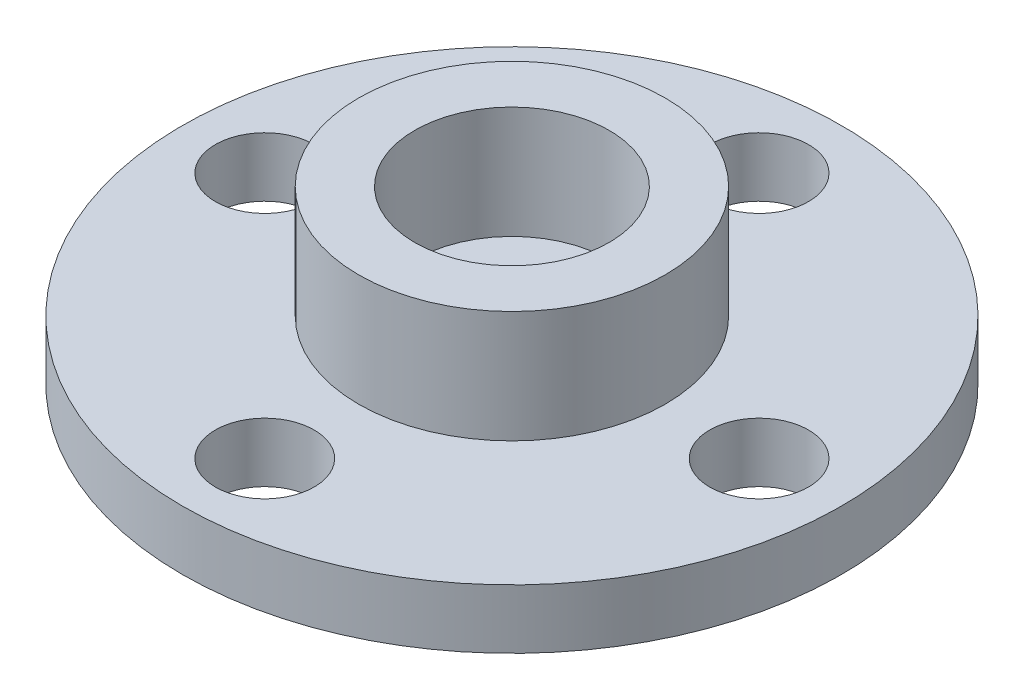
ISO-10303-21;
HEADER;
FILE_DESCRIPTION(('STEP AP214'),'2;1');
FILE_NAME('part.step','',(''),(''),'','','');
FILE_SCHEMA(('AUTOMOTIVE_DESIGN { 1 0 10303 214 1 1 1 1 }'));
ENDSEC;
DATA;
#1=APPLICATION_CONTEXT('core data for automotive mechanical design processes');
#2=APPLICATION_PROTOCOL_DEFINITION('international standard','automotive_design',2000,#1);
#3=PRODUCT_CONTEXT('',#1,'mechanical');
#4=PRODUCT('Part','Part','',(#3));
#5=PRODUCT_RELATED_PRODUCT_CATEGORY('part','',(#4));
#6=PRODUCT_DEFINITION_FORMATION('','',#4);
#7=PRODUCT_DEFINITION_CONTEXT('part definition',#1,'design');
#8=PRODUCT_DEFINITION('design','',#6,#7);
#9=PRODUCT_DEFINITION_SHAPE('','',#8);
#10=(LENGTH_UNIT() NAMED_UNIT(*) SI_UNIT(.MILLI.,.METRE.));
#11=(NAMED_UNIT(*) PLANE_ANGLE_UNIT() SI_UNIT($,.RADIAN.));
#12=(NAMED_UNIT(*) SI_UNIT($,.STERADIAN.) SOLID_ANGLE_UNIT());
#13=UNCERTAINTY_MEASURE_WITH_UNIT(LENGTH_MEASURE(1.E-05),#10,'distance_accuracy_value','');
#14=(GEOMETRIC_REPRESENTATION_CONTEXT(3) GLOBAL_UNCERTAINTY_ASSIGNED_CONTEXT((#13)) GLOBAL_UNIT_ASSIGNED_CONTEXT((#10,
#11,#12)) REPRESENTATION_CONTEXT('',''));
#15=CARTESIAN_POINT('',(0.,0.,0.));
#16=DIRECTION('',(0.,0.,1.));
#17=DIRECTION('',(1.,0.,0.));
#18=AXIS2_PLACEMENT_3D('',#15,#16,#17);
#19=CARTESIAN_POINT('',(0.,5.2,0.));
#20=DIRECTION('',(0.,-1.,0.));
#21=DIRECTION('',(0.,0.,-1.));
#22=AXIS2_PLACEMENT_3D('',#19,#20,#21);
#23=CYLINDRICAL_SURFACE('',#22,10.);
#24=CARTESIAN_POINT('',(0.,0.,0.));
#25=DIRECTION('',(0.,1.,0.));
#26=DIRECTION('',(0.,0.,1.));
#27=AXIS2_PLACEMENT_3D('',#24,#25,#26);
#28=CIRCLE('',#27,10.);
#29=CARTESIAN_POINT('',(0.,0.,10.));
#30=VERTEX_POINT('',#29);
#31=EDGE_CURVE('E10',#30,#30,#28,.T.);
#32=ORIENTED_EDGE('',*,*,#31,.T.);
#33=EDGE_LOOP('',(#32));
#34=FACE_BOUND('',#33,.T.);
#35=CARTESIAN_POINT('',(0.,1.8,0.));
#36=DIRECTION('',(0.,1.,0.));
#37=DIRECTION('',(0.,0.,1.));
#38=AXIS2_PLACEMENT_3D('',#35,#36,#37);
#39=CIRCLE('',#38,10.);
#40=CARTESIAN_POINT('',(0.,1.8,10.));
#41=VERTEX_POINT('',#40);
#42=EDGE_CURVE('E36',#41,#41,#39,.T.);
#43=ORIENTED_EDGE('',*,*,#42,.F.);
#44=EDGE_LOOP('',(#43));
#45=FACE_BOUND('',#44,.T.);
#46=ADVANCED_FACE('F30',(#34,#45),#23,.T.);
#47=CARTESIAN_POINT('',(0.,0.,0.));
#48=DIRECTION('',(0.,1.,0.));
#49=DIRECTION('',(0.,0.,1.));
#50=AXIS2_PLACEMENT_3D('',#47,#48,#49);
#51=PLANE('',#50);
#52=CARTESIAN_POINT('',(0.,0.,7.5));
#53=DIRECTION('',(0.,1.,0.));
#54=DIRECTION('',(0.,0.,1.));
#55=AXIS2_PLACEMENT_3D('',#52,#53,#54);
#56=CIRCLE('',#55,1.5);
#57=CARTESIAN_POINT('',(0.,0.,9.));
#58=VERTEX_POINT('',#57);
#59=EDGE_CURVE('E70',#58,#58,#56,.F.);
#60=ORIENTED_EDGE('',*,*,#59,.F.);
#61=EDGE_LOOP('',(#60));
#62=FACE_BOUND('',#61,.T.);
#63=CARTESIAN_POINT('',(7.5,0.,0.));
#64=DIRECTION('',(0.,1.,0.));
#65=DIRECTION('',(0.,0.,1.));
#66=AXIS2_PLACEMENT_3D('',#63,#64,#65);
#67=CIRCLE('',#66,1.5);
#68=CARTESIAN_POINT('',(7.5,0.,1.50000000000005));
#69=VERTEX_POINT('',#68);
#70=EDGE_CURVE('E64',#69,#69,#67,.F.);
#71=ORIENTED_EDGE('',*,*,#70,.F.);
#72=EDGE_LOOP('',(#71));
#73=FACE_BOUND('',#72,.T.);
#74=CARTESIAN_POINT('',(0.,0.,-7.5));
#75=DIRECTION('',(0.,1.,0.));
#76=DIRECTION('',(0.,0.,1.));
#77=AXIS2_PLACEMENT_3D('',#74,#75,#76);
#78=CIRCLE('',#77,1.5);
#79=CARTESIAN_POINT('',(0.,0.,-6.));
#80=VERTEX_POINT('',#79);
#81=EDGE_CURVE('E58',#80,#80,#78,.F.);
#82=ORIENTED_EDGE('',*,*,#81,.F.);
#83=EDGE_LOOP('',(#82));
#84=FACE_BOUND('',#83,.T.);
#85=CARTESIAN_POINT('',(-7.5,0.,0.));
#86=DIRECTION('',(0.,1.,0.));
#87=DIRECTION('',(0.,0.,1.));
#88=AXIS2_PLACEMENT_3D('',#85,#86,#87);
#89=CIRCLE('',#88,1.5);
#90=CARTESIAN_POINT('',(-7.5,0.,1.5));
#91=VERTEX_POINT('',#90);
#92=EDGE_CURVE('E52',#91,#91,#89,.F.);
#93=ORIENTED_EDGE('',*,*,#92,.F.);
#94=EDGE_LOOP('',(#93));
#95=FACE_BOUND('',#94,.T.);
#96=CARTESIAN_POINT('',(0.,0.,0.));
#97=DIRECTION('',(0.,1.,0.));
#98=DIRECTION('',(0.,0.,1.));
#99=AXIS2_PLACEMENT_3D('',#96,#97,#98);
#100=CIRCLE('',#99,1.5);
#101=CARTESIAN_POINT('',(0.,0.,1.5));
#102=VERTEX_POINT('',#101);
#103=EDGE_CURVE('E48',#102,#102,#100,.F.);
#104=ORIENTED_EDGE('',*,*,#103,.F.);
#105=EDGE_LOOP('',(#104));
#106=FACE_BOUND('',#105,.T.);
#107=ORIENTED_EDGE('',*,*,#31,.F.);
#108=EDGE_LOOP('',(#107));
#109=FACE_BOUND('',#108,.T.);
#110=ADVANCED_FACE('F103',(#62,#73,#84,#95,#106,#109),#51,.F.);
#111=CARTESIAN_POINT('',(0.,1.8,0.));
#112=DIRECTION('',(0.,1.,0.));
#113=DIRECTION('',(0.,0.,1.));
#114=AXIS2_PLACEMENT_3D('',#111,#112,#113);
#115=PLANE('',#114);
#116=CARTESIAN_POINT('',(0.,1.8,7.5));
#117=DIRECTION('',(0.,1.,0.));
#118=DIRECTION('',(0.,0.,1.));
#119=AXIS2_PLACEMENT_3D('',#116,#117,#118);
#120=CIRCLE('',#119,1.5);
#121=CARTESIAN_POINT('',(0.,1.8,9.));
#122=VERTEX_POINT('',#121);
#123=EDGE_CURVE('E73',#122,#122,#120,.T.);
#124=ORIENTED_EDGE('',*,*,#123,.F.);
#125=EDGE_LOOP('',(#124));
#126=FACE_BOUND('',#125,.T.);
#127=CARTESIAN_POINT('',(7.5,1.8,0.));
#128=DIRECTION('',(0.,1.,0.));
#129=DIRECTION('',(0.,0.,1.));
#130=AXIS2_PLACEMENT_3D('',#127,#128,#129);
#131=CIRCLE('',#130,1.5);
#132=CARTESIAN_POINT('',(7.5,1.8,1.50000000000005));
#133=VERTEX_POINT('',#132);
#134=EDGE_CURVE('E67',#133,#133,#131,.T.);
#135=ORIENTED_EDGE('',*,*,#134,.F.);
#136=EDGE_LOOP('',(#135));
#137=FACE_BOUND('',#136,.T.);
#138=CARTESIAN_POINT('',(0.,1.8,-7.5));
#139=DIRECTION('',(0.,1.,0.));
#140=DIRECTION('',(0.,0.,1.));
#141=AXIS2_PLACEMENT_3D('',#138,#139,#140);
#142=CIRCLE('',#141,1.5);
#143=CARTESIAN_POINT('',(0.,1.8,-6.));
#144=VERTEX_POINT('',#143);
#145=EDGE_CURVE('E61',#144,#144,#142,.T.);
#146=ORIENTED_EDGE('',*,*,#145,.F.);
#147=EDGE_LOOP('',(#146));
#148=FACE_BOUND('',#147,.T.);
#149=CARTESIAN_POINT('',(-7.5,1.8,0.));
#150=DIRECTION('',(0.,1.,0.));
#151=DIRECTION('',(0.,0.,1.));
#152=AXIS2_PLACEMENT_3D('',#149,#150,#151);
#153=CIRCLE('',#152,1.5);
#154=CARTESIAN_POINT('',(-7.5,1.8,1.5));
#155=VERTEX_POINT('',#154);
#156=EDGE_CURVE('E55',#155,#155,#153,.T.);
#157=ORIENTED_EDGE('',*,*,#156,.F.);
#158=EDGE_LOOP('',(#157));
#159=FACE_BOUND('',#158,.T.);
#160=CARTESIAN_POINT('',(0.,1.8,0.));
#161=DIRECTION('',(0.,1.,0.));
#162=DIRECTION('',(0.,0.,1.));
#163=AXIS2_PLACEMENT_3D('',#160,#161,#162);
#164=CIRCLE('',#163,4.65);
#165=CARTESIAN_POINT('',(0.,1.8,4.65));
#166=VERTEX_POINT('',#165);
#167=EDGE_CURVE('E40',#166,#166,#164,.T.);
#168=ORIENTED_EDGE('',*,*,#167,.F.);
#169=EDGE_LOOP('',(#168));
#170=FACE_BOUND('',#169,.T.);
#171=ORIENTED_EDGE('',*,*,#42,.T.);
#172=EDGE_LOOP('',(#171));
#173=FACE_BOUND('',#172,.T.);
#174=ADVANCED_FACE('F97',(#126,#137,#148,#159,#170,#173),#115,.T.);
#175=CARTESIAN_POINT('',(0.,1.8,0.));
#176=DIRECTION('',(0.,1.,0.));
#177=DIRECTION('',(0.,0.,1.));
#178=AXIS2_PLACEMENT_3D('',#175,#176,#177);
#179=CYLINDRICAL_SURFACE('',#178,4.65);
#180=ORIENTED_EDGE('',*,*,#167,.T.);
#181=EDGE_LOOP('',(#180));
#182=FACE_BOUND('',#181,.T.);
#183=CARTESIAN_POINT('',(0.,5.2,0.));
#184=DIRECTION('',(0.,1.,0.));
#185=DIRECTION('',(0.,0.,1.));
#186=AXIS2_PLACEMENT_3D('',#183,#184,#185);
#187=CIRCLE('',#186,4.65);
#188=CARTESIAN_POINT('',(0.,5.2,4.65));
#189=VERTEX_POINT('',#188);
#190=EDGE_CURVE('E44',#189,#189,#187,.T.);
#191=ORIENTED_EDGE('',*,*,#190,.F.);
#192=EDGE_LOOP('',(#191));
#193=FACE_BOUND('',#192,.T.);
#194=ADVANCED_FACE('F92',(#182,#193),#179,.T.);
#195=CARTESIAN_POINT('',(0.,5.2,0.));
#196=DIRECTION('',(0.,1.,0.));
#197=DIRECTION('',(0.,0.,1.));
#198=AXIS2_PLACEMENT_3D('',#195,#196,#197);
#199=PLANE('',#198);
#200=CARTESIAN_POINT('',(0.,5.2,0.));
#201=DIRECTION('',(0.,1.,0.));
#202=DIRECTION('',(0.,0.,1.));
#203=AXIS2_PLACEMENT_3D('',#200,#201,#202);
#204=CIRCLE('',#203,2.95);
#205=CARTESIAN_POINT('',(0.,5.2,2.95));
#206=VERTEX_POINT('',#205);
#207=EDGE_CURVE('E82',#206,#206,#204,.T.);
#208=ORIENTED_EDGE('',*,*,#207,.F.);
#209=EDGE_LOOP('',(#208));
#210=FACE_BOUND('',#209,.T.);
#211=ORIENTED_EDGE('',*,*,#190,.T.);
#212=EDGE_LOOP('',(#211));
#213=FACE_BOUND('',#212,.T.);
#214=ADVANCED_FACE('F88',(#210,#213),#199,.T.);
#215=CARTESIAN_POINT('',(0.,-0.000999999999999916,0.));
#216=DIRECTION('',(0.,1.,0.));
#217=DIRECTION('',(0.,0.,1.));
#218=AXIS2_PLACEMENT_3D('',#215,#216,#217);
#219=CYLINDRICAL_SURFACE('',#218,1.5);
#220=CARTESIAN_POINT('',(0.,1.8,0.));
#221=DIRECTION('',(0.,1.,0.));
#222=DIRECTION('',(0.,0.,1.));
#223=AXIS2_PLACEMENT_3D('',#220,#221,#222);
#224=CIRCLE('',#223,1.5);
#225=CARTESIAN_POINT('',(0.,1.8,1.5));
#226=VERTEX_POINT('',#225);
#227=EDGE_CURVE('E76',#226,#226,#224,.F.);
#228=CARTESIAN_POINT('',(0.,1.8,1.5));
#229=CARTESIAN_POINT('',(0.,1.78125,1.5));
#230=CARTESIAN_POINT('',(0.,1.7625,1.5));
#231=CARTESIAN_POINT('',(0.,1.725,1.5));
#232=CARTESIAN_POINT('',(0.,1.70625,1.5));
#233=CARTESIAN_POINT('',(0.,1.66875,1.5));
#234=CARTESIAN_POINT('',(0.,1.65,1.5));
#235=CARTESIAN_POINT('',(0.,1.6125,1.5));
#236=CARTESIAN_POINT('',(0.,1.59375,1.5));
#237=CARTESIAN_POINT('',(0.,1.55625,1.5));
#238=CARTESIAN_POINT('',(0.,1.5375,1.5));
#239=CARTESIAN_POINT('',(0.,1.5,1.5));
#240=CARTESIAN_POINT('',(0.,1.48125,1.5));
#241=CARTESIAN_POINT('',(0.,1.44375,1.5));
#242=CARTESIAN_POINT('',(0.,1.425,1.5));
#243=CARTESIAN_POINT('',(0.,1.3875,1.5));
#244=CARTESIAN_POINT('',(0.,1.36875,1.5));
#245=CARTESIAN_POINT('',(0.,1.33125,1.5));
#246=CARTESIAN_POINT('',(0.,1.3125,1.5));
#247=CARTESIAN_POINT('',(0.,1.275,1.5));
#248=CARTESIAN_POINT('',(0.,1.25625,1.5));
#249=CARTESIAN_POINT('',(0.,1.21875,1.5));
#250=CARTESIAN_POINT('',(0.,1.2,1.5));
#251=CARTESIAN_POINT('',(0.,1.1625,1.5));
#252=CARTESIAN_POINT('',(0.,1.14375,1.5));
#253=CARTESIAN_POINT('',(0.,1.10625,1.5));
#254=CARTESIAN_POINT('',(0.,1.0875,1.5));
#255=CARTESIAN_POINT('',(0.,1.05,1.5));
#256=CARTESIAN_POINT('',(0.,1.03125,1.5));
#257=CARTESIAN_POINT('',(0.,0.99375,1.5));
#258=CARTESIAN_POINT('',(0.,0.975,1.5));
#259=CARTESIAN_POINT('',(0.,0.9375,1.5));
#260=CARTESIAN_POINT('',(0.,0.91875,1.5));
#261=CARTESIAN_POINT('',(0.,0.88125,1.5));
#262=CARTESIAN_POINT('',(0.,0.8625,1.5));
#263=CARTESIAN_POINT('',(0.,0.825,1.5));
#264=CARTESIAN_POINT('',(0.,0.80625,1.5));
#265=CARTESIAN_POINT('',(0.,0.76875,1.5));
#266=CARTESIAN_POINT('',(0.,0.75,1.5));
#267=CARTESIAN_POINT('',(0.,0.7125,1.5));
#268=CARTESIAN_POINT('',(0.,0.69375,1.5));
#269=CARTESIAN_POINT('',(0.,0.65625,1.5));
#270=CARTESIAN_POINT('',(0.,0.6375,1.5));
#271=CARTESIAN_POINT('',(0.,0.6,1.5));
#272=CARTESIAN_POINT('',(0.,0.58125,1.5));
#273=CARTESIAN_POINT('',(0.,0.54375,1.5));
#274=CARTESIAN_POINT('',(0.,0.525,1.5));
#275=CARTESIAN_POINT('',(0.,0.4875,1.5));
#276=CARTESIAN_POINT('',(0.,0.46875,1.5));
#277=CARTESIAN_POINT('',(0.,0.43125,1.5));
#278=CARTESIAN_POINT('',(0.,0.4125,1.5));
#279=CARTESIAN_POINT('',(0.,0.375,1.5));
#280=CARTESIAN_POINT('',(0.,0.35625,1.5));
#281=CARTESIAN_POINT('',(0.,0.31875,1.5));
#282=CARTESIAN_POINT('',(0.,0.3,1.5));
#283=CARTESIAN_POINT('',(0.,0.2625,1.5));
#284=CARTESIAN_POINT('',(0.,0.24375,1.5));
#285=CARTESIAN_POINT('',(0.,0.20625,1.5));
#286=CARTESIAN_POINT('',(0.,0.1875,1.5));
#287=CARTESIAN_POINT('',(0.,0.15,1.5));
#288=CARTESIAN_POINT('',(0.,0.13125,1.5));
#289=CARTESIAN_POINT('',(0.,0.09375,1.5));
#290=CARTESIAN_POINT('',(0.,0.075,1.5));
#291=CARTESIAN_POINT('',(0.,0.0375000000000001,1.5));
#292=CARTESIAN_POINT('',(0.,0.01875,1.5));
#293=CARTESIAN_POINT('',(0.,0.,1.5));
#294=B_SPLINE_CURVE_WITH_KNOTS('',3,(#228,#229,#230,#231,#232,#233,#234,#235,#236,#237,#238,
#239,#240,#241,#242,#243,#244,#245,#246,#247,#248,#249,#250,#251,#252,#253,#254,#255,#256,#257,
#258,#259,#260,#261,#262,#263,#264,#265,#266,#267,#268,#269,#270,#271,#272,#273,#274,#275,#276,
#277,#278,#279,#280,#281,#282,#283,#284,#285,#286,#287,#288,#289,#290,#291,#292,#293),
.UNSPECIFIED.,.F.,.F.,(4,2,2,2,2,2,2,2,2,2,2,2,2,2,2,2,2,2,2,2,2,2,2,2,2,2,2,2,2,2,2,2,4),(0.,
0.0562500000000001,0.1125,0.16875,0.225,0.28125,0.3375,0.39375,0.45,0.50625,0.5625,0.61875,
0.675,0.73125,0.7875,0.84375,0.9,0.95625,1.0125,1.06875,1.125,1.18125,1.2375,1.29375,1.35,
1.40625,1.4625,1.51875,1.575,1.63125,1.6875,1.74375,1.8),.UNSPECIFIED.);
#295=EDGE_CURVE('BSEAM91',#226,#102,#294,.T.);
#296=ORIENTED_EDGE('',*,*,#227,.F.);
#297=ORIENTED_EDGE('',*,*,#103,.T.);
#298=ORIENTED_EDGE('',*,*,#295,.T.);
#299=ORIENTED_EDGE('',*,*,#295,.F.);
#300=EDGE_LOOP('',(#296,#298,#297,#299));
#301=FACE_BOUND('',#300,.T.);
#302=ADVANCED_FACE('F91',(#301),#219,.F.);
#303=CARTESIAN_POINT('',(-7.5,-0.000999999999999916,0.));
#304=DIRECTION('',(0.,1.,0.));
#305=DIRECTION('',(0.,0.,1.));
#306=AXIS2_PLACEMENT_3D('',#303,#304,#305);
#307=CYLINDRICAL_SURFACE('',#306,1.5);
#308=CARTESIAN_POINT('',(-7.5,1.8,1.5));
#309=CARTESIAN_POINT('',(-7.5,1.78125,1.5));
#310=CARTESIAN_POINT('',(-7.5,1.7625,1.5));
#311=CARTESIAN_POINT('',(-7.5,1.725,1.5));
#312=CARTESIAN_POINT('',(-7.5,1.70625,1.5));
#313=CARTESIAN_POINT('',(-7.5,1.66875,1.5));
#314=CARTESIAN_POINT('',(-7.5,1.65,1.5));
#315=CARTESIAN_POINT('',(-7.5,1.6125,1.5));
#316=CARTESIAN_POINT('',(-7.5,1.59375,1.5));
#317=CARTESIAN_POINT('',(-7.5,1.55625,1.5));
#318=CARTESIAN_POINT('',(-7.5,1.5375,1.5));
#319=CARTESIAN_POINT('',(-7.5,1.5,1.5));
#320=CARTESIAN_POINT('',(-7.5,1.48125,1.5));
#321=CARTESIAN_POINT('',(-7.5,1.44375,1.5));
#322=CARTESIAN_POINT('',(-7.5,1.425,1.5));
#323=CARTESIAN_POINT('',(-7.5,1.3875,1.5));
#324=CARTESIAN_POINT('',(-7.5,1.36875,1.5));
#325=CARTESIAN_POINT('',(-7.5,1.33125,1.5));
#326=CARTESIAN_POINT('',(-7.5,1.3125,1.5));
#327=CARTESIAN_POINT('',(-7.5,1.275,1.5));
#328=CARTESIAN_POINT('',(-7.5,1.25625,1.5));
#329=CARTESIAN_POINT('',(-7.5,1.21875,1.5));
#330=CARTESIAN_POINT('',(-7.5,1.2,1.5));
#331=CARTESIAN_POINT('',(-7.5,1.1625,1.5));
#332=CARTESIAN_POINT('',(-7.5,1.14375,1.5));
#333=CARTESIAN_POINT('',(-7.5,1.10625,1.5));
#334=CARTESIAN_POINT('',(-7.5,1.0875,1.5));
#335=CARTESIAN_POINT('',(-7.5,1.05,1.5));
#336=CARTESIAN_POINT('',(-7.5,1.03125,1.5));
#337=CARTESIAN_POINT('',(-7.5,0.99375,1.5));
#338=CARTESIAN_POINT('',(-7.5,0.975,1.5));
#339=CARTESIAN_POINT('',(-7.5,0.9375,1.5));
#340=CARTESIAN_POINT('',(-7.5,0.91875,1.5));
#341=CARTESIAN_POINT('',(-7.5,0.88125,1.5));
#342=CARTESIAN_POINT('',(-7.5,0.8625,1.5));
#343=CARTESIAN_POINT('',(-7.5,0.825,1.5));
#344=CARTESIAN_POINT('',(-7.5,0.80625,1.5));
#345=CARTESIAN_POINT('',(-7.5,0.76875,1.5));
#346=CARTESIAN_POINT('',(-7.5,0.75,1.5));
#347=CARTESIAN_POINT('',(-7.5,0.7125,1.5));
#348=CARTESIAN_POINT('',(-7.5,0.69375,1.5));
#349=CARTESIAN_POINT('',(-7.5,0.65625,1.5));
#350=CARTESIAN_POINT('',(-7.5,0.6375,1.5));
#351=CARTESIAN_POINT('',(-7.5,0.6,1.5));
#352=CARTESIAN_POINT('',(-7.5,0.58125,1.5));
#353=CARTESIAN_POINT('',(-7.5,0.54375,1.5));
#354=CARTESIAN_POINT('',(-7.5,0.525,1.5));
#355=CARTESIAN_POINT('',(-7.5,0.4875,1.5));
#356=CARTESIAN_POINT('',(-7.5,0.46875,1.5));
#357=CARTESIAN_POINT('',(-7.5,0.43125,1.5));
#358=CARTESIAN_POINT('',(-7.5,0.4125,1.5));
#359=CARTESIAN_POINT('',(-7.5,0.375,1.5));
#360=CARTESIAN_POINT('',(-7.5,0.35625,1.5));
#361=CARTESIAN_POINT('',(-7.5,0.31875,1.5));
#362=CARTESIAN_POINT('',(-7.5,0.3,1.5));
#363=CARTESIAN_POINT('',(-7.5,0.2625,1.5));
#364=CARTESIAN_POINT('',(-7.5,0.24375,1.5));
#365=CARTESIAN_POINT('',(-7.5,0.20625,1.5));
#366=CARTESIAN_POINT('',(-7.5,0.1875,1.5));
#367=CARTESIAN_POINT('',(-7.5,0.15,1.5));
#368=CARTESIAN_POINT('',(-7.5,0.13125,1.5));
#369=CARTESIAN_POINT('',(-7.5,0.09375,1.5));
#370=CARTESIAN_POINT('',(-7.5,0.075,1.5));
#371=CARTESIAN_POINT('',(-7.5,0.0375000000000001,1.5));
#372=CARTESIAN_POINT('',(-7.5,0.01875,1.5));
#373=CARTESIAN_POINT('',(-7.5,0.,1.5));
#374=B_SPLINE_CURVE_WITH_KNOTS('',3,(#308,#309,#310,#311,#312,#313,#314,#315,#316,#317,#318,
#319,#320,#321,#322,#323,#324,#325,#326,#327,#328,#329,#330,#331,#332,#333,#334,#335,#336,#337,
#338,#339,#340,#341,#342,#343,#344,#345,#346,#347,#348,#349,#350,#351,#352,#353,#354,#355,#356,
#357,#358,#359,#360,#361,#362,#363,#364,#365,#366,#367,#368,#369,#370,#371,#372,#373),
.UNSPECIFIED.,.F.,.F.,(4,2,2,2,2,2,2,2,2,2,2,2,2,2,2,2,2,2,2,2,2,2,2,2,2,2,2,2,2,2,2,2,4),(0.,
0.0562500000000001,0.1125,0.16875,0.225,0.28125,0.3375,0.39375,0.45,0.50625,0.5625,0.61875,
0.675,0.73125,0.7875,0.84375,0.9,0.95625,1.0125,1.06875,1.125,1.18125,1.2375,1.29375,1.35,
1.40625,1.4625,1.51875,1.575,1.63125,1.6875,1.74375,1.8),.UNSPECIFIED.);
#375=EDGE_CURVE('BSEAM127',#155,#91,#374,.T.);
#376=ORIENTED_EDGE('',*,*,#156,.T.);
#377=ORIENTED_EDGE('',*,*,#92,.T.);
#378=ORIENTED_EDGE('',*,*,#375,.T.);
#379=ORIENTED_EDGE('',*,*,#375,.F.);
#380=EDGE_LOOP('',(#376,#378,#377,#379));
#381=FACE_BOUND('',#380,.T.);
#382=ADVANCED_FACE('F127',(#381),#307,.F.);
#383=CARTESIAN_POINT('',(0.,-0.000999999999999916,-7.5));
#384=DIRECTION('',(0.,1.,0.));
#385=DIRECTION('',(0.,0.,1.));
#386=AXIS2_PLACEMENT_3D('',#383,#384,#385);
#387=CYLINDRICAL_SURFACE('',#386,1.5);
#388=CARTESIAN_POINT('',(0.,1.8,-6.));
#389=CARTESIAN_POINT('',(0.,1.78125,-6.));
#390=CARTESIAN_POINT('',(0.,1.7625,-6.));
#391=CARTESIAN_POINT('',(0.,1.725,-6.));
#392=CARTESIAN_POINT('',(0.,1.70625,-6.));
#393=CARTESIAN_POINT('',(0.,1.66875,-6.));
#394=CARTESIAN_POINT('',(0.,1.65,-6.));
#395=CARTESIAN_POINT('',(0.,1.6125,-6.));
#396=CARTESIAN_POINT('',(0.,1.59375,-6.));
#397=CARTESIAN_POINT('',(0.,1.55625,-6.));
#398=CARTESIAN_POINT('',(0.,1.5375,-6.));
#399=CARTESIAN_POINT('',(0.,1.5,-6.));
#400=CARTESIAN_POINT('',(0.,1.48125,-6.));
#401=CARTESIAN_POINT('',(0.,1.44375,-6.));
#402=CARTESIAN_POINT('',(0.,1.425,-6.));
#403=CARTESIAN_POINT('',(0.,1.3875,-6.));
#404=CARTESIAN_POINT('',(0.,1.36875,-6.));
#405=CARTESIAN_POINT('',(0.,1.33125,-6.));
#406=CARTESIAN_POINT('',(0.,1.3125,-6.));
#407=CARTESIAN_POINT('',(0.,1.275,-6.));
#408=CARTESIAN_POINT('',(0.,1.25625,-6.));
#409=CARTESIAN_POINT('',(0.,1.21875,-6.));
#410=CARTESIAN_POINT('',(0.,1.2,-6.));
#411=CARTESIAN_POINT('',(0.,1.1625,-6.));
#412=CARTESIAN_POINT('',(0.,1.14375,-6.));
#413=CARTESIAN_POINT('',(0.,1.10625,-6.));
#414=CARTESIAN_POINT('',(0.,1.0875,-6.));
#415=CARTESIAN_POINT('',(0.,1.05,-6.));
#416=CARTESIAN_POINT('',(0.,1.03125,-6.));
#417=CARTESIAN_POINT('',(0.,0.99375,-6.));
#418=CARTESIAN_POINT('',(0.,0.975,-6.));
#419=CARTESIAN_POINT('',(0.,0.9375,-6.));
#420=CARTESIAN_POINT('',(0.,0.91875,-6.));
#421=CARTESIAN_POINT('',(0.,0.88125,-6.));
#422=CARTESIAN_POINT('',(0.,0.8625,-6.));
#423=CARTESIAN_POINT('',(0.,0.825,-6.));
#424=CARTESIAN_POINT('',(0.,0.80625,-6.));
#425=CARTESIAN_POINT('',(0.,0.76875,-6.));
#426=CARTESIAN_POINT('',(0.,0.75,-6.));
#427=CARTESIAN_POINT('',(0.,0.7125,-6.));
#428=CARTESIAN_POINT('',(0.,0.69375,-6.));
#429=CARTESIAN_POINT('',(0.,0.65625,-6.));
#430=CARTESIAN_POINT('',(0.,0.6375,-6.));
#431=CARTESIAN_POINT('',(0.,0.6,-6.));
#432=CARTESIAN_POINT('',(0.,0.58125,-6.));
#433=CARTESIAN_POINT('',(0.,0.54375,-6.));
#434=CARTESIAN_POINT('',(0.,0.525,-6.));
#435=CARTESIAN_POINT('',(0.,0.4875,-6.));
#436=CARTESIAN_POINT('',(0.,0.46875,-6.));
#437=CARTESIAN_POINT('',(0.,0.43125,-6.));
#438=CARTESIAN_POINT('',(0.,0.4125,-6.));
#439=CARTESIAN_POINT('',(0.,0.375,-6.));
#440=CARTESIAN_POINT('',(0.,0.35625,-6.));
#441=CARTESIAN_POINT('',(0.,0.31875,-6.));
#442=CARTESIAN_POINT('',(0.,0.3,-6.));
#443=CARTESIAN_POINT('',(0.,0.2625,-6.));
#444=CARTESIAN_POINT('',(0.,0.24375,-6.));
#445=CARTESIAN_POINT('',(0.,0.20625,-6.));
#446=CARTESIAN_POINT('',(0.,0.1875,-6.));
#447=CARTESIAN_POINT('',(0.,0.15,-6.));
#448=CARTESIAN_POINT('',(0.,0.13125,-6.));
#449=CARTESIAN_POINT('',(0.,0.09375,-6.));
#450=CARTESIAN_POINT('',(0.,0.075,-6.));
#451=CARTESIAN_POINT('',(0.,0.0375000000000001,-6.));
#452=CARTESIAN_POINT('',(0.,0.01875,-6.));
#453=CARTESIAN_POINT('',(0.,0.,-6.));
#454=B_SPLINE_CURVE_WITH_KNOTS('',3,(#388,#389,#390,#391,#392,#393,#394,#395,#396,#397,#398,
#399,#400,#401,#402,#403,#404,#405,#406,#407,#408,#409,#410,#411,#412,#413,#414,#415,#416,#417,
#418,#419,#420,#421,#422,#423,#424,#425,#426,#427,#428,#429,#430,#431,#432,#433,#434,#435,#436,
#437,#438,#439,#440,#441,#442,#443,#444,#445,#446,#447,#448,#449,#450,#451,#452,#453),
.UNSPECIFIED.,.F.,.F.,(4,2,2,2,2,2,2,2,2,2,2,2,2,2,2,2,2,2,2,2,2,2,2,2,2,2,2,2,2,2,2,2,4),(0.,
0.0562500000000001,0.1125,0.16875,0.225,0.28125,0.3375,0.39375,0.45,0.50625,0.5625,0.61875,
0.675,0.73125,0.7875,0.84375,0.9,0.95625,1.0125,1.06875,1.125,1.18125,1.2375,1.29375,1.35,
1.40625,1.4625,1.51875,1.575,1.63125,1.6875,1.74375,1.8),.UNSPECIFIED.);
#455=EDGE_CURVE('BSEAM132',#144,#80,#454,.T.);
#456=ORIENTED_EDGE('',*,*,#145,.T.);
#457=ORIENTED_EDGE('',*,*,#81,.T.);
#458=ORIENTED_EDGE('',*,*,#455,.T.);
#459=ORIENTED_EDGE('',*,*,#455,.F.);
#460=EDGE_LOOP('',(#456,#458,#457,#459));
#461=FACE_BOUND('',#460,.T.);
#462=ADVANCED_FACE('F132',(#461),#387,.F.);
#463=CARTESIAN_POINT('',(7.5,-0.000999999999999916,0.));
#464=DIRECTION('',(0.,1.,0.));
#465=DIRECTION('',(0.,0.,1.));
#466=AXIS2_PLACEMENT_3D('',#463,#464,#465);
#467=CYLINDRICAL_SURFACE('',#466,1.5);
#468=CARTESIAN_POINT('',(7.5,1.8,1.50000000000005));
#469=CARTESIAN_POINT('',(7.5,1.78125,1.50000000000005));
#470=CARTESIAN_POINT('',(7.5,1.7625,1.50000000000005));
#471=CARTESIAN_POINT('',(7.5,1.725,1.50000000000005));
#472=CARTESIAN_POINT('',(7.5,1.70625,1.50000000000005));
#473=CARTESIAN_POINT('',(7.5,1.66875,1.50000000000005));
#474=CARTESIAN_POINT('',(7.5,1.65,1.50000000000005));
#475=CARTESIAN_POINT('',(7.5,1.6125,1.50000000000005));
#476=CARTESIAN_POINT('',(7.5,1.59375,1.50000000000005));
#477=CARTESIAN_POINT('',(7.5,1.55625,1.50000000000005));
#478=CARTESIAN_POINT('',(7.5,1.5375,1.50000000000005));
#479=CARTESIAN_POINT('',(7.5,1.5,1.50000000000005));
#480=CARTESIAN_POINT('',(7.5,1.48125,1.50000000000005));
#481=CARTESIAN_POINT('',(7.5,1.44375,1.50000000000005));
#482=CARTESIAN_POINT('',(7.5,1.425,1.50000000000005));
#483=CARTESIAN_POINT('',(7.5,1.3875,1.50000000000005));
#484=CARTESIAN_POINT('',(7.5,1.36875,1.50000000000005));
#485=CARTESIAN_POINT('',(7.5,1.33125,1.50000000000005));
#486=CARTESIAN_POINT('',(7.5,1.3125,1.50000000000005));
#487=CARTESIAN_POINT('',(7.5,1.275,1.50000000000005));
#488=CARTESIAN_POINT('',(7.5,1.25625,1.50000000000005));
#489=CARTESIAN_POINT('',(7.5,1.21875,1.50000000000005));
#490=CARTESIAN_POINT('',(7.5,1.2,1.50000000000005));
#491=CARTESIAN_POINT('',(7.5,1.1625,1.50000000000005));
#492=CARTESIAN_POINT('',(7.5,1.14375,1.50000000000005));
#493=CARTESIAN_POINT('',(7.5,1.10625,1.50000000000005));
#494=CARTESIAN_POINT('',(7.5,1.0875,1.50000000000005));
#495=CARTESIAN_POINT('',(7.5,1.05,1.50000000000005));
#496=CARTESIAN_POINT('',(7.5,1.03125,1.50000000000005));
#497=CARTESIAN_POINT('',(7.5,0.99375,1.50000000000005));
#498=CARTESIAN_POINT('',(7.5,0.975,1.50000000000005));
#499=CARTESIAN_POINT('',(7.5,0.9375,1.50000000000005));
#500=CARTESIAN_POINT('',(7.5,0.91875,1.50000000000005));
#501=CARTESIAN_POINT('',(7.5,0.88125,1.50000000000005));
#502=CARTESIAN_POINT('',(7.5,0.8625,1.50000000000005));
#503=CARTESIAN_POINT('',(7.5,0.825,1.50000000000005));
#504=CARTESIAN_POINT('',(7.5,0.80625,1.50000000000005));
#505=CARTESIAN_POINT('',(7.5,0.76875,1.50000000000005));
#506=CARTESIAN_POINT('',(7.5,0.75,1.50000000000005));
#507=CARTESIAN_POINT('',(7.5,0.7125,1.50000000000005));
#508=CARTESIAN_POINT('',(7.5,0.69375,1.50000000000005));
#509=CARTESIAN_POINT('',(7.5,0.65625,1.50000000000005));
#510=CARTESIAN_POINT('',(7.5,0.6375,1.50000000000005));
#511=CARTESIAN_POINT('',(7.5,0.6,1.50000000000005));
#512=CARTESIAN_POINT('',(7.5,0.58125,1.50000000000005));
#513=CARTESIAN_POINT('',(7.5,0.54375,1.50000000000005));
#514=CARTESIAN_POINT('',(7.5,0.525,1.50000000000005));
#515=CARTESIAN_POINT('',(7.5,0.4875,1.50000000000005));
#516=CARTESIAN_POINT('',(7.5,0.46875,1.50000000000005));
#517=CARTESIAN_POINT('',(7.5,0.43125,1.50000000000005));
#518=CARTESIAN_POINT('',(7.5,0.4125,1.50000000000005));
#519=CARTESIAN_POINT('',(7.5,0.375,1.50000000000005));
#520=CARTESIAN_POINT('',(7.5,0.35625,1.50000000000005));
#521=CARTESIAN_POINT('',(7.5,0.31875,1.50000000000005));
#522=CARTESIAN_POINT('',(7.5,0.3,1.50000000000005));
#523=CARTESIAN_POINT('',(7.5,0.2625,1.50000000000005));
#524=CARTESIAN_POINT('',(7.5,0.24375,1.50000000000005));
#525=CARTESIAN_POINT('',(7.5,0.20625,1.50000000000005));
#526=CARTESIAN_POINT('',(7.5,0.1875,1.50000000000005));
#527=CARTESIAN_POINT('',(7.5,0.15,1.50000000000005));
#528=CARTESIAN_POINT('',(7.5,0.13125,1.50000000000005));
#529=CARTESIAN_POINT('',(7.5,0.09375,1.50000000000005));
#530=CARTESIAN_POINT('',(7.5,0.075,1.50000000000005));
#531=CARTESIAN_POINT('',(7.5,0.0375000000000001,1.50000000000005));
#532=CARTESIAN_POINT('',(7.5,0.01875,1.50000000000005));
#533=CARTESIAN_POINT('',(7.5,0.,1.50000000000005));
#534=B_SPLINE_CURVE_WITH_KNOTS('',3,(#468,#469,#470,#471,#472,#473,#474,#475,#476,#477,#478,
#479,#480,#481,#482,#483,#484,#485,#486,#487,#488,#489,#490,#491,#492,#493,#494,#495,#496,#497,
#498,#499,#500,#501,#502,#503,#504,#505,#506,#507,#508,#509,#510,#511,#512,#513,#514,#515,#516,
#517,#518,#519,#520,#521,#522,#523,#524,#525,#526,#527,#528,#529,#530,#531,#532,#533),
.UNSPECIFIED.,.F.,.F.,(4,2,2,2,2,2,2,2,2,2,2,2,2,2,2,2,2,2,2,2,2,2,2,2,2,2,2,2,2,2,2,2,4),(0.,
0.0562500000000001,0.1125,0.16875,0.225,0.28125,0.3375,0.39375,0.45,0.50625,0.5625,0.61875,
0.675,0.73125,0.7875,0.84375,0.9,0.95625,1.0125,1.06875,1.125,1.18125,1.2375,1.29375,1.35,
1.40625,1.4625,1.51875,1.575,1.63125,1.6875,1.74375,1.8),.UNSPECIFIED.);
#535=EDGE_CURVE('BSEAM139',#133,#69,#534,.T.);
#536=ORIENTED_EDGE('',*,*,#134,.T.);
#537=ORIENTED_EDGE('',*,*,#70,.T.);
#538=ORIENTED_EDGE('',*,*,#535,.T.);
#539=ORIENTED_EDGE('',*,*,#535,.F.);
#540=EDGE_LOOP('',(#536,#538,#537,#539));
#541=FACE_BOUND('',#540,.T.);
#542=ADVANCED_FACE('F139',(#541),#467,.F.);
#543=CARTESIAN_POINT('',(0.,-0.000999999999999916,7.5));
#544=DIRECTION('',(0.,1.,0.));
#545=DIRECTION('',(0.,0.,1.));
#546=AXIS2_PLACEMENT_3D('',#543,#544,#545);
#547=CYLINDRICAL_SURFACE('',#546,1.5);
#548=CARTESIAN_POINT('',(0.,1.8,9.));
#549=CARTESIAN_POINT('',(0.,1.78125,9.));
#550=CARTESIAN_POINT('',(0.,1.7625,9.));
#551=CARTESIAN_POINT('',(0.,1.725,9.));
#552=CARTESIAN_POINT('',(0.,1.70625,9.));
#553=CARTESIAN_POINT('',(0.,1.66875,9.));
#554=CARTESIAN_POINT('',(0.,1.65,9.));
#555=CARTESIAN_POINT('',(0.,1.6125,9.));
#556=CARTESIAN_POINT('',(0.,1.59375,9.));
#557=CARTESIAN_POINT('',(0.,1.55625,9.));
#558=CARTESIAN_POINT('',(0.,1.5375,9.));
#559=CARTESIAN_POINT('',(0.,1.5,9.));
#560=CARTESIAN_POINT('',(0.,1.48125,9.));
#561=CARTESIAN_POINT('',(0.,1.44375,9.));
#562=CARTESIAN_POINT('',(0.,1.425,9.));
#563=CARTESIAN_POINT('',(0.,1.3875,9.));
#564=CARTESIAN_POINT('',(0.,1.36875,9.));
#565=CARTESIAN_POINT('',(0.,1.33125,9.));
#566=CARTESIAN_POINT('',(0.,1.3125,9.));
#567=CARTESIAN_POINT('',(0.,1.275,9.));
#568=CARTESIAN_POINT('',(0.,1.25625,9.));
#569=CARTESIAN_POINT('',(0.,1.21875,9.));
#570=CARTESIAN_POINT('',(0.,1.2,9.));
#571=CARTESIAN_POINT('',(0.,1.1625,9.));
#572=CARTESIAN_POINT('',(0.,1.14375,9.));
#573=CARTESIAN_POINT('',(0.,1.10625,9.));
#574=CARTESIAN_POINT('',(0.,1.0875,9.));
#575=CARTESIAN_POINT('',(0.,1.05,9.));
#576=CARTESIAN_POINT('',(0.,1.03125,9.));
#577=CARTESIAN_POINT('',(0.,0.99375,9.));
#578=CARTESIAN_POINT('',(0.,0.975,9.));
#579=CARTESIAN_POINT('',(0.,0.9375,9.));
#580=CARTESIAN_POINT('',(0.,0.91875,9.));
#581=CARTESIAN_POINT('',(0.,0.88125,9.));
#582=CARTESIAN_POINT('',(0.,0.8625,9.));
#583=CARTESIAN_POINT('',(0.,0.825,9.));
#584=CARTESIAN_POINT('',(0.,0.80625,9.));
#585=CARTESIAN_POINT('',(0.,0.76875,9.));
#586=CARTESIAN_POINT('',(0.,0.75,9.));
#587=CARTESIAN_POINT('',(0.,0.7125,9.));
#588=CARTESIAN_POINT('',(0.,0.69375,9.));
#589=CARTESIAN_POINT('',(0.,0.65625,9.));
#590=CARTESIAN_POINT('',(0.,0.6375,9.));
#591=CARTESIAN_POINT('',(0.,0.6,9.));
#592=CARTESIAN_POINT('',(0.,0.58125,9.));
#593=CARTESIAN_POINT('',(0.,0.54375,9.));
#594=CARTESIAN_POINT('',(0.,0.525,9.));
#595=CARTESIAN_POINT('',(0.,0.4875,9.));
#596=CARTESIAN_POINT('',(0.,0.46875,9.));
#597=CARTESIAN_POINT('',(0.,0.43125,9.));
#598=CARTESIAN_POINT('',(0.,0.4125,9.));
#599=CARTESIAN_POINT('',(0.,0.375,9.));
#600=CARTESIAN_POINT('',(0.,0.35625,9.));
#601=CARTESIAN_POINT('',(0.,0.31875,9.));
#602=CARTESIAN_POINT('',(0.,0.3,9.));
#603=CARTESIAN_POINT('',(0.,0.2625,9.));
#604=CARTESIAN_POINT('',(0.,0.24375,9.));
#605=CARTESIAN_POINT('',(0.,0.20625,9.));
#606=CARTESIAN_POINT('',(0.,0.1875,9.));
#607=CARTESIAN_POINT('',(0.,0.15,9.));
#608=CARTESIAN_POINT('',(0.,0.13125,9.));
#609=CARTESIAN_POINT('',(0.,0.09375,9.));
#610=CARTESIAN_POINT('',(0.,0.075,9.));
#611=CARTESIAN_POINT('',(0.,0.0375000000000001,9.));
#612=CARTESIAN_POINT('',(0.,0.01875,9.));
#613=CARTESIAN_POINT('',(0.,0.,9.));
#614=B_SPLINE_CURVE_WITH_KNOTS('',3,(#548,#549,#550,#551,#552,#553,#554,#555,#556,#557,#558,
#559,#560,#561,#562,#563,#564,#565,#566,#567,#568,#569,#570,#571,#572,#573,#574,#575,#576,#577,
#578,#579,#580,#581,#582,#583,#584,#585,#586,#587,#588,#589,#590,#591,#592,#593,#594,#595,#596,
#597,#598,#599,#600,#601,#602,#603,#604,#605,#606,#607,#608,#609,#610,#611,#612,#613),
.UNSPECIFIED.,.F.,.F.,(4,2,2,2,2,2,2,2,2,2,2,2,2,2,2,2,2,2,2,2,2,2,2,2,2,2,2,2,2,2,2,2,4),(0.,
0.0562500000000001,0.1125,0.16875,0.225,0.28125,0.3375,0.39375,0.45,0.50625,0.5625,0.61875,
0.675,0.73125,0.7875,0.84375,0.9,0.95625,1.0125,1.06875,1.125,1.18125,1.2375,1.29375,1.35,
1.40625,1.4625,1.51875,1.575,1.63125,1.6875,1.74375,1.8),.UNSPECIFIED.);
#615=EDGE_CURVE('BSEAM143',#122,#58,#614,.T.);
#616=ORIENTED_EDGE('',*,*,#123,.T.);
#617=ORIENTED_EDGE('',*,*,#59,.T.);
#618=ORIENTED_EDGE('',*,*,#615,.T.);
#619=ORIENTED_EDGE('',*,*,#615,.F.);
#620=EDGE_LOOP('',(#616,#618,#617,#619));
#621=FACE_BOUND('',#620,.T.);
#622=ADVANCED_FACE('F143',(#621),#547,.F.);
#623=CARTESIAN_POINT('',(0.,1.8,0.));
#624=DIRECTION('',(0.,1.,0.));
#625=DIRECTION('',(0.,0.,1.));
#626=AXIS2_PLACEMENT_3D('',#623,#624,#625);
#627=PLANE('',#626);
#628=CARTESIAN_POINT('',(0.,1.8,0.));
#629=DIRECTION('',(0.,1.,0.));
#630=DIRECTION('',(0.,0.,1.));
#631=AXIS2_PLACEMENT_3D('',#628,#629,#630);
#632=CIRCLE('',#631,2.95);
#633=CARTESIAN_POINT('',(0.,1.8,2.95));
#634=VERTEX_POINT('',#633);
#635=EDGE_CURVE('E79',#634,#634,#632,.F.);
#636=ORIENTED_EDGE('',*,*,#635,.F.);
#637=EDGE_LOOP('',(#636));
#638=FACE_BOUND('',#637,.T.);
#639=ORIENTED_EDGE('',*,*,#227,.T.);
#640=EDGE_LOOP('',(#639));
#641=FACE_BOUND('',#640,.T.);
#642=ADVANCED_FACE('F147',(#638,#641),#627,.T.);
#643=CARTESIAN_POINT('',(0.,-6.54386001800126,0.));
#644=DIRECTION('',(0.,1.,0.));
#645=DIRECTION('',(0.,0.,1.));
#646=AXIS2_PLACEMENT_3D('',#643,#644,#645);
#647=CYLINDRICAL_SURFACE('',#646,2.95);
#648=CARTESIAN_POINT('',(0.,1.8,2.95));
#649=CARTESIAN_POINT('',(0.,1.83541666666667,2.95));
#650=CARTESIAN_POINT('',(0.,1.87083333333333,2.95));
#651=CARTESIAN_POINT('',(0.,1.94166666666667,2.95));
#652=CARTESIAN_POINT('',(0.,1.97708333333333,2.95));
#653=CARTESIAN_POINT('',(0.,2.04791666666667,2.95));
#654=CARTESIAN_POINT('',(0.,2.08333333333333,2.95));
#655=CARTESIAN_POINT('',(0.,2.15416666666667,2.95));
#656=CARTESIAN_POINT('',(0.,2.18958333333333,2.95));
#657=CARTESIAN_POINT('',(0.,2.26041666666667,2.95));
#658=CARTESIAN_POINT('',(0.,2.29583333333333,2.95));
#659=CARTESIAN_POINT('',(0.,2.36666666666667,2.95));
#660=CARTESIAN_POINT('',(0.,2.40208333333333,2.95));
#661=CARTESIAN_POINT('',(0.,2.47291666666667,2.95));
#662=CARTESIAN_POINT('',(0.,2.50833333333333,2.95));
#663=CARTESIAN_POINT('',(0.,2.57916666666667,2.95));
#664=CARTESIAN_POINT('',(0.,2.61458333333333,2.95));
#665=CARTESIAN_POINT('',(0.,2.68541666666667,2.95));
#666=CARTESIAN_POINT('',(0.,2.72083333333333,2.95));
#667=CARTESIAN_POINT('',(0.,2.79166666666667,2.95));
#668=CARTESIAN_POINT('',(0.,2.82708333333333,2.95));
#669=CARTESIAN_POINT('',(0.,2.89791666666667,2.95));
#670=CARTESIAN_POINT('',(0.,2.93333333333333,2.95));
#671=CARTESIAN_POINT('',(0.,3.00416666666667,2.95));
#672=CARTESIAN_POINT('',(0.,3.03958333333333,2.95));
#673=CARTESIAN_POINT('',(0.,3.11041666666667,2.95));
#674=CARTESIAN_POINT('',(0.,3.14583333333333,2.95));
#675=CARTESIAN_POINT('',(0.,3.21666666666667,2.95));
#676=CARTESIAN_POINT('',(0.,3.25208333333333,2.95));
#677=CARTESIAN_POINT('',(0.,3.32291666666667,2.95));
#678=CARTESIAN_POINT('',(0.,3.35833333333333,2.95));
#679=CARTESIAN_POINT('',(0.,3.42916666666667,2.95));
#680=CARTESIAN_POINT('',(0.,3.46458333333333,2.95));
#681=CARTESIAN_POINT('',(0.,3.53541666666667,2.95));
#682=CARTESIAN_POINT('',(0.,3.57083333333333,2.95));
#683=CARTESIAN_POINT('',(0.,3.64166666666667,2.95));
#684=CARTESIAN_POINT('',(0.,3.67708333333333,2.95));
#685=CARTESIAN_POINT('',(0.,3.74791666666667,2.95));
#686=CARTESIAN_POINT('',(0.,3.78333333333333,2.95));
#687=CARTESIAN_POINT('',(0.,3.85416666666667,2.95));
#688=CARTESIAN_POINT('',(0.,3.88958333333333,2.95));
#689=CARTESIAN_POINT('',(0.,3.96041666666667,2.95));
#690=CARTESIAN_POINT('',(0.,3.99583333333333,2.95));
#691=CARTESIAN_POINT('',(0.,4.06666666666667,2.95));
#692=CARTESIAN_POINT('',(0.,4.10208333333333,2.95));
#693=CARTESIAN_POINT('',(0.,4.17291666666667,2.95));
#694=CARTESIAN_POINT('',(0.,4.20833333333333,2.95));
#695=CARTESIAN_POINT('',(0.,4.27916666666667,2.95));
#696=CARTESIAN_POINT('',(0.,4.31458333333333,2.95));
#697=CARTESIAN_POINT('',(0.,4.38541666666667,2.95));
#698=CARTESIAN_POINT('',(0.,4.42083333333333,2.95));
#699=CARTESIAN_POINT('',(0.,4.49166666666667,2.95));
#700=CARTESIAN_POINT('',(0.,4.52708333333333,2.95));
#701=CARTESIAN_POINT('',(0.,4.59791666666667,2.95));
#702=CARTESIAN_POINT('',(0.,4.63333333333333,2.95));
#703=CARTESIAN_POINT('',(0.,4.70416666666667,2.95));
#704=CARTESIAN_POINT('',(0.,4.73958333333333,2.95));
#705=CARTESIAN_POINT('',(0.,4.81041666666667,2.95));
#706=CARTESIAN_POINT('',(0.,4.84583333333333,2.95));
#707=CARTESIAN_POINT('',(0.,4.91666666666667,2.95));
#708=CARTESIAN_POINT('',(0.,4.95208333333333,2.95));
#709=CARTESIAN_POINT('',(0.,5.02291666666667,2.95));
#710=CARTESIAN_POINT('',(0.,5.05833333333333,2.95));
#711=CARTESIAN_POINT('',(0.,5.12916666666667,2.95));
#712=CARTESIAN_POINT('',(0.,5.16458333333333,2.95));
#713=CARTESIAN_POINT('',(0.,5.2,2.95));
#714=B_SPLINE_CURVE_WITH_KNOTS('',3,(#648,#649,#650,#651,#652,#653,#654,#655,#656,#657,#658,
#659,#660,#661,#662,#663,#664,#665,#666,#667,#668,#669,#670,#671,#672,#673,#674,#675,#676,#677,
#678,#679,#680,#681,#682,#683,#684,#685,#686,#687,#688,#689,#690,#691,#692,#693,#694,#695,#696,
#697,#698,#699,#700,#701,#702,#703,#704,#705,#706,#707,#708,#709,#710,#711,#712,#713),
.UNSPECIFIED.,.F.,.F.,(4,2,2,2,2,2,2,2,2,2,2,2,2,2,2,2,2,2,2,2,2,2,2,2,2,2,2,2,2,2,2,2,4),(0.,
0.10625,0.212500000000001,0.31875,0.425,0.53125,0.637499999999999,0.74375,0.85,0.95625,1.0625,
1.16875,1.275,1.38125,1.4875,1.59375,1.7,1.80625,1.9125,2.01875,2.125,2.23125,2.3375,2.44375,
2.55,2.65625,2.7625,2.86875,2.975,3.08125,3.1875,3.29375,3.4),.UNSPECIFIED.);
#715=EDGE_CURVE('BSEAM86',#634,#206,#714,.T.);
#716=ORIENTED_EDGE('',*,*,#635,.T.);
#717=ORIENTED_EDGE('',*,*,#207,.T.);
#718=ORIENTED_EDGE('',*,*,#715,.T.);
#719=ORIENTED_EDGE('',*,*,#715,.F.);
#720=EDGE_LOOP('',(#716,#718,#717,#719));
#721=FACE_BOUND('',#720,.T.);
#722=ADVANCED_FACE('F86',(#721),#647,.F.);
#723=CLOSED_SHELL('',(#46,#110,#174,#194,#214,#302,#382,#462,#542,#622,#642,#722));
#724=MANIFOLD_SOLID_BREP('B2',#723);
#725=ADVANCED_BREP_SHAPE_REPRESENTATION('',(#18,#724),#14);
#726=SHAPE_DEFINITION_REPRESENTATION(#9,#725);
ENDSEC;
END-ISO-10303-21;
